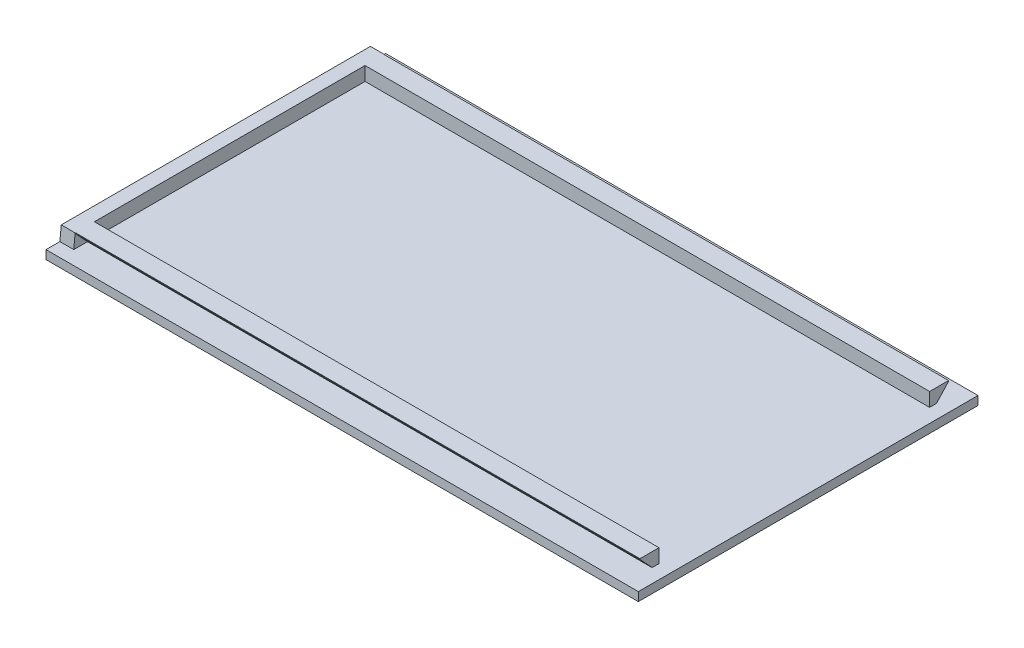
ISO-10303-21;
HEADER;
FILE_DESCRIPTION(('STEP AP214'),'2;1');
FILE_NAME('part.step','',(''),(''),'','','');
FILE_SCHEMA(('AUTOMOTIVE_DESIGN { 1 0 10303 214 1 1 1 1 }'));
ENDSEC;
DATA;
#1=APPLICATION_CONTEXT('core data for automotive mechanical design processes');
#2=APPLICATION_PROTOCOL_DEFINITION('international standard','automotive_design',2000,#1);
#3=PRODUCT_CONTEXT('',#1,'mechanical');
#4=PRODUCT('Part','Part','',(#3));
#5=PRODUCT_RELATED_PRODUCT_CATEGORY('part','',(#4));
#6=PRODUCT_DEFINITION_FORMATION('','',#4);
#7=PRODUCT_DEFINITION_CONTEXT('part definition',#1,'design');
#8=PRODUCT_DEFINITION('design','',#6,#7);
#9=PRODUCT_DEFINITION_SHAPE('','',#8);
#10=(LENGTH_UNIT() NAMED_UNIT(*) SI_UNIT(.MILLI.,.METRE.));
#11=(NAMED_UNIT(*) PLANE_ANGLE_UNIT() SI_UNIT($,.RADIAN.));
#12=(NAMED_UNIT(*) SI_UNIT($,.STERADIAN.) SOLID_ANGLE_UNIT());
#13=UNCERTAINTY_MEASURE_WITH_UNIT(LENGTH_MEASURE(1.E-05),#10,'distance_accuracy_value','');
#14=(GEOMETRIC_REPRESENTATION_CONTEXT(3) GLOBAL_UNCERTAINTY_ASSIGNED_CONTEXT((#13)) GLOBAL_UNIT_ASSIGNED_CONTEXT((#10,
#11,#12)) REPRESENTATION_CONTEXT('',''));
#15=CARTESIAN_POINT('',(0.,0.,0.));
#16=DIRECTION('',(0.,0.,1.));
#17=DIRECTION('',(1.,0.,0.));
#18=AXIS2_PLACEMENT_3D('',#15,#16,#17);
#19=CARTESIAN_POINT('',(2.01,0.,0.));
#20=DIRECTION('',(-1.,0.,0.));
#21=DIRECTION('',(0.,0.,1.));
#22=AXIS2_PLACEMENT_3D('',#19,#20,#21);
#23=PLANE('',#22);
#24=DIRECTION('',(0.,0.,-1.));
#25=VECTOR('',#24,1.);
#26=CARTESIAN_POINT('',(2.01,3.26,-46.989750156055));
#27=LINE('',#26,#25);
#28=CARTESIAN_POINT('',(2.01,3.26,-5.00000000000004));
#29=VERTEX_POINT('',#28);
#30=CARTESIAN_POINT('',(2.01,3.26,-44.2));
#31=VERTEX_POINT('',#30);
#32=EDGE_CURVE('E348',#29,#31,#27,.T.);
#33=ORIENTED_EDGE('',*,*,#32,.F.);
#34=DIRECTION('',(0.,-1.,0.));
#35=VECTOR('',#34,1.);
#36=CARTESIAN_POINT('',(2.01,0.,-5.00000000000003));
#37=LINE('',#36,#35);
#38=CARTESIAN_POINT('',(2.01,1.26,-5.00000000000004));
#39=VERTEX_POINT('',#38);
#40=EDGE_CURVE('E304',#29,#39,#37,.T.);
#41=ORIENTED_EDGE('',*,*,#40,.T.);
#42=DIRECTION('',(0.,0.,1.));
#43=VECTOR('',#42,1.);
#44=CARTESIAN_POINT('',(2.01,1.26,-47.19));
#45=LINE('',#44,#43);
#46=CARTESIAN_POINT('',(2.01,1.26,-44.2));
#47=VERTEX_POINT('',#46);
#48=EDGE_CURVE('E339',#47,#39,#45,.T.);
#49=ORIENTED_EDGE('',*,*,#48,.F.);
#50=DIRECTION('',(0.,1.,0.));
#51=VECTOR('',#50,1.);
#52=CARTESIAN_POINT('',(2.01,0.,-44.2));
#53=LINE('',#52,#51);
#54=EDGE_CURVE('E11',#47,#31,#53,.T.);
#55=ORIENTED_EDGE('',*,*,#54,.T.);
#56=EDGE_LOOP('',(#33,#41,#49,#55));
#57=FACE_BOUND('',#56,.T.);
#58=ADVANCED_FACE('F32',(#57),#23,.F.);
#59=CARTESIAN_POINT('',(2.01,1.26,-4.00000000000004));
#60=VERTEX_POINT('',#59);
#61=CARTESIAN_POINT('',(2.01,1.26,-2.01));
#62=VERTEX_POINT('',#61);
#63=EDGE_CURVE('E340',#60,#62,#45,.T.);
#64=ORIENTED_EDGE('',*,*,#63,.F.);
#65=DIRECTION('',(0.,0.733696405240078,0.679477435193979));
#66=VECTOR('',#65,1.);
#67=CARTESIAN_POINT('',(2.01,2.57584948359591,-2.78138965131976));
#68=LINE('',#67,#66);
#69=CARTESIAN_POINT('',(2.01,3.1602736895718,-2.24015344284762));
#70=VERTEX_POINT('',#69);
#71=EDGE_CURVE('E306',#60,#70,#68,.T.);
#72=ORIENTED_EDGE('',*,*,#71,.T.);
#73=DIRECTION('',(0.,0.997263104282015,-0.07393443607548));
#74=VECTOR('',#73,1.);
#75=CARTESIAN_POINT('',(2.01,-0.147896177868239,-1.99489452116399));
#76=LINE('',#75,#74);
#77=CARTESIAN_POINT('',(2.01,3.26,-2.24754688645518));
#78=VERTEX_POINT('',#77);
#79=EDGE_CURVE('E294',#70,#78,#76,.T.);
#80=ORIENTED_EDGE('',*,*,#79,.T.);
#81=CARTESIAN_POINT('',(2.01,3.26,-2.210249843945));
#82=VERTEX_POINT('',#81);
#83=EDGE_CURVE('E344',#82,#78,#27,.T.);
#84=ORIENTED_EDGE('',*,*,#83,.F.);
#85=DIRECTION('',(0.,0.995024875621891,-0.0996267880323402));
#86=VECTOR('',#85,1.);
#87=CARTESIAN_POINT('',(2.01,1.26,-2.01));
#88=LINE('',#87,#86);
#89=EDGE_CURVE('E338',#62,#82,#88,.T.);
#90=ORIENTED_EDGE('',*,*,#89,.F.);
#91=EDGE_LOOP('',(#64,#72,#80,#84,#90));
#92=FACE_BOUND('',#91,.T.);
#93=ADVANCED_FACE('F459',(#92),#23,.F.);
#94=CARTESIAN_POINT('',(0.,1.26,0.));
#95=DIRECTION('',(0.,-1.,0.));
#96=DIRECTION('',(0.,0.,-1.));
#97=AXIS2_PLACEMENT_3D('',#94,#95,#96);
#98=PLANE('',#97);
#99=ORIENTED_EDGE('',*,*,#48,.T.);
#100=DIRECTION('',(1.,0.,0.));
#101=VECTOR('',#100,1.);
#102=CARTESIAN_POINT('',(0.,1.26,-5.00000000000002));
#103=LINE('',#102,#101);
#104=CARTESIAN_POINT('',(83.79,1.26,-5.00000000000005));
#105=VERTEX_POINT('',#104);
#106=EDGE_CURVE('E295',#39,#105,#103,.T.);
#107=ORIENTED_EDGE('',*,*,#106,.T.);
#108=DIRECTION('',(0.,0.,-1.));
#109=VECTOR('',#108,1.);
#110=CARTESIAN_POINT('',(83.79,1.26,-5.00000000000005));
#111=LINE('',#110,#109);
#112=CARTESIAN_POINT('',(83.79,1.26,-4.00000000000005));
#113=VERTEX_POINT('',#112);
#114=EDGE_CURVE('E285',#113,#105,#111,.T.);
#115=ORIENTED_EDGE('',*,*,#114,.F.);
#116=DIRECTION('',(1.,0.,0.));
#117=VECTOR('',#116,1.);
#118=CARTESIAN_POINT('',(0.,1.26,-4.00000000000002));
#119=LINE('',#118,#117);
#120=EDGE_CURVE('E297',#60,#113,#119,.T.);
#121=ORIENTED_EDGE('',*,*,#120,.F.);
#122=ORIENTED_EDGE('',*,*,#63,.T.);
#123=DIRECTION('',(-1.,0.,0.));
#124=VECTOR('',#123,1.);
#125=CARTESIAN_POINT('',(2.01,1.26,-2.01));
#126=LINE('',#125,#124);
#127=CARTESIAN_POINT('',(0.,1.26,-2.01));
#128=VERTEX_POINT('',#127);
#129=EDGE_CURVE('E351',#62,#128,#126,.T.);
#130=ORIENTED_EDGE('',*,*,#129,.T.);
#131=DIRECTION('',(0.,0.,1.));
#132=VECTOR('',#131,1.);
#133=CARTESIAN_POINT('',(0.,1.26,0.));
#134=LINE('',#133,#132);
#135=CARTESIAN_POINT('',(0.,1.26,0.));
#136=VERTEX_POINT('',#135);
#137=EDGE_CURVE('E373',#128,#136,#134,.T.);
#138=ORIENTED_EDGE('',*,*,#137,.T.);
#139=DIRECTION('',(1.,0.,0.));
#140=VECTOR('',#139,1.);
#141=CARTESIAN_POINT('',(0.,1.26,0.));
#142=LINE('',#141,#140);
#143=CARTESIAN_POINT('',(85.8,1.26,0.));
#144=VERTEX_POINT('',#143);
#145=EDGE_CURVE('E372',#136,#144,#142,.T.);
#146=ORIENTED_EDGE('',*,*,#145,.T.);
#147=DIRECTION('',(0.,0.,-1.));
#148=VECTOR('',#147,1.);
#149=CARTESIAN_POINT('',(85.8,1.26,0.));
#150=LINE('',#149,#148);
#151=CARTESIAN_POINT('',(85.8,1.26,-49.2));
#152=VERTEX_POINT('',#151);
#153=EDGE_CURVE('E375',#144,#152,#150,.T.);
#154=ORIENTED_EDGE('',*,*,#153,.T.);
#155=DIRECTION('',(-1.,0.,0.));
#156=VECTOR('',#155,1.);
#157=CARTESIAN_POINT('',(0.,1.26,-49.2));
#158=LINE('',#157,#156);
#159=CARTESIAN_POINT('',(0.,1.26,-49.2));
#160=VERTEX_POINT('',#159);
#161=EDGE_CURVE('E377',#152,#160,#158,.T.);
#162=ORIENTED_EDGE('',*,*,#161,.T.);
#163=CARTESIAN_POINT('',(0.,1.26,-47.19));
#164=VERTEX_POINT('',#163);
#165=EDGE_CURVE('E369',#160,#164,#134,.T.);
#166=ORIENTED_EDGE('',*,*,#165,.T.);
#167=DIRECTION('',(-1.,0.,0.));
#168=VECTOR('',#167,1.);
#169=CARTESIAN_POINT('',(2.01,1.26,-47.19));
#170=LINE('',#169,#168);
#171=CARTESIAN_POINT('',(2.01,1.26,-47.19));
#172=VERTEX_POINT('',#171);
#173=EDGE_CURVE('E359',#172,#164,#170,.T.);
#174=ORIENTED_EDGE('',*,*,#173,.F.);
#175=CARTESIAN_POINT('',(2.01,1.26,-45.2));
#176=VERTEX_POINT('',#175);
#177=EDGE_CURVE('E335',#172,#176,#45,.T.);
#178=ORIENTED_EDGE('',*,*,#177,.T.);
#179=DIRECTION('',(1.,0.,0.));
#180=VECTOR('',#179,1.);
#181=CARTESIAN_POINT('',(0.,1.26,-45.2));
#182=LINE('',#181,#180);
#183=CARTESIAN_POINT('',(83.79,1.26,-45.2));
#184=VERTEX_POINT('',#183);
#185=EDGE_CURVE('E331',#176,#184,#182,.T.);
#186=ORIENTED_EDGE('',*,*,#185,.T.);
#187=DIRECTION('',(0.,0.,-1.));
#188=VECTOR('',#187,1.);
#189=CARTESIAN_POINT('',(83.79,1.26,-44.2));
#190=LINE('',#189,#188);
#191=CARTESIAN_POINT('',(83.79,1.26,-44.2));
#192=VERTEX_POINT('',#191);
#193=EDGE_CURVE('E311',#192,#184,#190,.T.);
#194=ORIENTED_EDGE('',*,*,#193,.F.);
#195=DIRECTION('',(1.,0.,0.));
#196=VECTOR('',#195,1.);
#197=CARTESIAN_POINT('',(0.,1.26,-44.2));
#198=LINE('',#197,#196);
#199=EDGE_CURVE('E323',#47,#192,#198,.T.);
#200=ORIENTED_EDGE('',*,*,#199,.F.);
#201=EDGE_LOOP('',(#99,#107,#115,#121,#122,#130,#138,#146,#154,#162,#166,#174,#178,#186,#194,#200));
#202=FACE_BOUND('',#201,.T.);
#203=ADVANCED_FACE('F424',(#202),#98,.F.);
#204=CARTESIAN_POINT('',(0.,1.26,0.));
#205=DIRECTION('',(1.,0.,0.));
#206=DIRECTION('',(0.,0.,-1.));
#207=AXIS2_PLACEMENT_3D('',#204,#205,#206);
#208=PLANE('',#207);
#209=DIRECTION('',(0.,0.,-1.));
#210=VECTOR('',#209,1.);
#211=CARTESIAN_POINT('',(0.,3.26,-46.989750156055));
#212=LINE('',#211,#210);
#213=CARTESIAN_POINT('',(0.,3.26,-2.210249843945));
#214=VERTEX_POINT('',#213);
#215=CARTESIAN_POINT('',(0.,3.26,-46.989750156055));
#216=VERTEX_POINT('',#215);
#217=EDGE_CURVE('E354',#214,#216,#212,.T.);
#218=ORIENTED_EDGE('',*,*,#217,.T.);
#219=DIRECTION('',(0.,-0.995024875621891,-0.0996267880323402));
#220=VECTOR('',#219,1.);
#221=CARTESIAN_POINT('',(0.,1.26,-47.19));
#222=LINE('',#221,#220);
#223=EDGE_CURVE('E356',#216,#164,#222,.T.);
#224=ORIENTED_EDGE('',*,*,#223,.T.);
#225=ORIENTED_EDGE('',*,*,#165,.F.);
#226=DIRECTION('',(0.,-1.,0.));
#227=VECTOR('',#226,1.);
#228=CARTESIAN_POINT('',(0.,1.26,-49.2));
#229=LINE('',#228,#227);
#230=CARTESIAN_POINT('',(0.,0.,-49.2));
#231=VERTEX_POINT('',#230);
#232=EDGE_CURVE('E379',#160,#231,#229,.T.);
#233=ORIENTED_EDGE('',*,*,#232,.T.);
#234=DIRECTION('',(0.,0.,1.));
#235=VECTOR('',#234,1.);
#236=CARTESIAN_POINT('',(0.,0.,0.));
#237=LINE('',#236,#235);
#238=CARTESIAN_POINT('',(0.,0.,0.));
#239=VERTEX_POINT('',#238);
#240=EDGE_CURVE('E361',#231,#239,#237,.T.);
#241=ORIENTED_EDGE('',*,*,#240,.T.);
#242=DIRECTION('',(0.,-1.,0.));
#243=VECTOR('',#242,1.);
#244=CARTESIAN_POINT('',(0.,1.26,0.));
#245=LINE('',#244,#243);
#246=EDGE_CURVE('E396',#136,#239,#245,.T.);
#247=ORIENTED_EDGE('',*,*,#246,.F.);
#248=ORIENTED_EDGE('',*,*,#137,.F.);
#249=DIRECTION('',(0.,0.995024875621891,-0.0996267880323402));
#250=VECTOR('',#249,1.);
#251=CARTESIAN_POINT('',(0.,1.26,-2.01));
#252=LINE('',#251,#250);
#253=EDGE_CURVE('E326',#128,#214,#252,.T.);
#254=ORIENTED_EDGE('',*,*,#253,.T.);
#255=EDGE_LOOP('',(#218,#224,#225,#233,#241,#247,#248,#254));
#256=FACE_BOUND('',#255,.T.);
#257=ADVANCED_FACE('F34',(#256),#208,.F.);
#258=CARTESIAN_POINT('',(0.,1.26,0.));
#259=DIRECTION('',(0.,0.,-1.));
#260=DIRECTION('',(-1.,0.,0.));
#261=AXIS2_PLACEMENT_3D('',#258,#259,#260);
#262=PLANE('',#261);
#263=DIRECTION('',(1.,0.,0.));
#264=VECTOR('',#263,1.);
#265=CARTESIAN_POINT('',(0.,0.,0.));
#266=LINE('',#265,#264);
#267=CARTESIAN_POINT('',(85.8,0.,0.));
#268=VERTEX_POINT('',#267);
#269=EDGE_CURVE('E382',#239,#268,#266,.T.);
#270=ORIENTED_EDGE('',*,*,#269,.T.);
#271=DIRECTION('',(0.,-1.,0.));
#272=VECTOR('',#271,1.);
#273=CARTESIAN_POINT('',(85.8,1.26,0.));
#274=LINE('',#273,#272);
#275=EDGE_CURVE('E393',#144,#268,#274,.T.);
#276=ORIENTED_EDGE('',*,*,#275,.F.);
#277=ORIENTED_EDGE('',*,*,#145,.F.);
#278=ORIENTED_EDGE('',*,*,#246,.T.);
#279=EDGE_LOOP('',(#270,#276,#277,#278));
#280=FACE_BOUND('',#279,.T.);
#281=ADVANCED_FACE('F497',(#280),#262,.F.);
#282=CARTESIAN_POINT('',(85.8,1.26,0.));
#283=DIRECTION('',(-1.,0.,0.));
#284=DIRECTION('',(0.,0.,1.));
#285=AXIS2_PLACEMENT_3D('',#282,#283,#284);
#286=PLANE('',#285);
#287=DIRECTION('',(0.,0.,-1.));
#288=VECTOR('',#287,1.);
#289=CARTESIAN_POINT('',(85.8,0.,0.));
#290=LINE('',#289,#288);
#291=CARTESIAN_POINT('',(85.8,0.,-49.2));
#292=VERTEX_POINT('',#291);
#293=EDGE_CURVE('E384',#268,#292,#290,.T.);
#294=ORIENTED_EDGE('',*,*,#293,.T.);
#295=DIRECTION('',(0.,-1.,0.));
#296=VECTOR('',#295,1.);
#297=CARTESIAN_POINT('',(85.8,1.26,-49.2));
#298=LINE('',#297,#296);
#299=EDGE_CURVE('E390',#152,#292,#298,.T.);
#300=ORIENTED_EDGE('',*,*,#299,.F.);
#301=ORIENTED_EDGE('',*,*,#153,.F.);
#302=ORIENTED_EDGE('',*,*,#275,.T.);
#303=EDGE_LOOP('',(#294,#300,#301,#302));
#304=FACE_BOUND('',#303,.T.);
#305=ADVANCED_FACE('F494',(#304),#286,.F.);
#306=CARTESIAN_POINT('',(0.,1.26,-49.2));
#307=DIRECTION('',(0.,0.,1.));
#308=DIRECTION('',(1.,0.,0.));
#309=AXIS2_PLACEMENT_3D('',#306,#307,#308);
#310=PLANE('',#309);
#311=DIRECTION('',(-1.,0.,0.));
#312=VECTOR('',#311,1.);
#313=CARTESIAN_POINT('',(0.,0.,-49.2));
#314=LINE('',#313,#312);
#315=EDGE_CURVE('E386',#292,#231,#314,.T.);
#316=ORIENTED_EDGE('',*,*,#315,.T.);
#317=ORIENTED_EDGE('',*,*,#232,.F.);
#318=ORIENTED_EDGE('',*,*,#161,.F.);
#319=ORIENTED_EDGE('',*,*,#299,.T.);
#320=EDGE_LOOP('',(#316,#317,#318,#319));
#321=FACE_BOUND('',#320,.T.);
#322=ADVANCED_FACE('F489',(#321),#310,.F.);
#323=CARTESIAN_POINT('',(0.,0.,0.));
#324=DIRECTION('',(0.,-1.,0.));
#325=DIRECTION('',(0.,0.,-1.));
#326=AXIS2_PLACEMENT_3D('',#323,#324,#325);
#327=PLANE('',#326);
#328=CARTESIAN_POINT('',(24.3670151213489,0.,-19.5845037734196));
#329=DIRECTION('',(0.,-1.,0.));
#330=DIRECTION('',(0.,0.,-1.));
#331=AXIS2_PLACEMENT_3D('',#328,#329,#330);
#332=CIRCLE('',#331,5.5);
#333=CARTESIAN_POINT('',(24.5437563050478,0.,-14.0873442747344));
#334=VERTEX_POINT('',#333);
#335=CARTESIAN_POINT('',(22.0546361829294,0.,-24.5747846918804));
#336=VERTEX_POINT('',#335);
#337=EDGE_CURVE('E47',#334,#336,#332,.T.);
#338=ORIENTED_EDGE('',*,*,#337,.F.);
#339=CARTESIAN_POINT('',(24.363202321441,0.,-33.043688370087));
#340=DIRECTION('',(0.,-1.,0.));
#341=DIRECTION('',(0.,0.,1.));
#342=AXIS2_PLACEMENT_3D('',#339,#340,#341);
#343=CIRCLE('',#342,18.9572039394633);
#344=CARTESIAN_POINT('',(41.3245511084577,0.,-24.5767982368934));
#345=VERTEX_POINT('',#344);
#346=EDGE_CURVE('E250',#345,#334,#343,.T.);
#347=ORIENTED_EDGE('',*,*,#346,.F.);
#348=CARTESIAN_POINT('',(24.363202321441,0.,-16.1099081036998));
#349=DIRECTION('',(0.,-1.,0.));
#350=DIRECTION('',(0.,0.,-1.));
#351=AXIS2_PLACEMENT_3D('',#348,#349,#350);
#352=CIRCLE('',#351,18.9572039394633);
#353=CARTESIAN_POINT('',(24.5437563050478,0.,-35.0662521990524));
#354=VERTEX_POINT('',#353);
#355=EDGE_CURVE('E264',#354,#345,#352,.T.);
#356=ORIENTED_EDGE('',*,*,#355,.F.);
#357=CARTESIAN_POINT('',(24.3576329942708,0.,-29.5694023636298));
#358=DIRECTION('',(0.,-1.,0.));
#359=DIRECTION('',(0.,0.,-1.));
#360=AXIS2_PLACEMENT_3D('',#357,#358,#359);
#361=CIRCLE('',#360,5.5);
#362=EDGE_CURVE('E261',#336,#354,#361,.T.);
#363=ORIENTED_EDGE('',*,*,#362,.F.);
#364=EDGE_LOOP('',(#338,#347,#356,#363));
#365=FACE_BOUND('',#364,.T.);
#366=ORIENTED_EDGE('',*,*,#240,.F.);
#367=ORIENTED_EDGE('',*,*,#315,.F.);
#368=ORIENTED_EDGE('',*,*,#293,.F.);
#369=ORIENTED_EDGE('',*,*,#269,.F.);
#370=EDGE_LOOP('',(#366,#367,#368,#369));
#371=FACE_BOUND('',#370,.T.);
#372=ADVANCED_FACE('F486',(#365,#371),#327,.T.);
#373=CARTESIAN_POINT('',(2.01,1.26,-47.19));
#374=DIRECTION('',(0.,0.0996267880323402,-0.995024875621891));
#375=DIRECTION('',(0.,0.995024875621891,0.0996267880323402));
#376=AXIS2_PLACEMENT_3D('',#373,#374,#375);
#377=PLANE('',#376);
#378=ORIENTED_EDGE('',*,*,#223,.F.);
#379=DIRECTION('',(-1.,0.,0.));
#380=VECTOR('',#379,1.);
#381=CARTESIAN_POINT('',(2.01,3.26,-46.989750156055));
#382=LINE('',#381,#380);
#383=CARTESIAN_POINT('',(2.01,3.26,-46.989750156055));
#384=VERTEX_POINT('',#383);
#385=EDGE_CURVE('E362',#384,#216,#382,.T.);
#386=ORIENTED_EDGE('',*,*,#385,.F.);
#387=DIRECTION('',(0.,-0.995024875621891,-0.0996267880323402));
#388=VECTOR('',#387,1.);
#389=CARTESIAN_POINT('',(2.01,1.26,-47.19));
#390=LINE('',#389,#388);
#391=EDGE_CURVE('E347',#384,#172,#390,.T.);
#392=ORIENTED_EDGE('',*,*,#391,.T.);
#393=ORIENTED_EDGE('',*,*,#173,.T.);
#394=EDGE_LOOP('',(#378,#386,#392,#393));
#395=FACE_BOUND('',#394,.T.);
#396=ADVANCED_FACE('F429',(#395),#377,.T.);
#397=CARTESIAN_POINT('',(2.01,3.26,-46.989750156055));
#398=DIRECTION('',(0.,1.,0.));
#399=DIRECTION('',(0.,0.,1.));
#400=AXIS2_PLACEMENT_3D('',#397,#398,#399);
#401=PLANE('',#400);
#402=ORIENTED_EDGE('',*,*,#83,.T.);
#403=DIRECTION('',(1.,0.,0.));
#404=VECTOR('',#403,1.);
#405=CARTESIAN_POINT('',(0.,3.26,-2.24754688645517));
#406=LINE('',#405,#404);
#407=CARTESIAN_POINT('',(83.79,3.26,-2.24754688645519));
#408=VERTEX_POINT('',#407);
#409=EDGE_CURVE('E291',#78,#408,#406,.T.);
#410=ORIENTED_EDGE('',*,*,#409,.T.);
#411=DIRECTION('',(0.,0.,1.));
#412=VECTOR('',#411,1.);
#413=CARTESIAN_POINT('',(83.79,3.26,-2.24754688645519));
#414=LINE('',#413,#412);
#415=CARTESIAN_POINT('',(83.79,3.26,-5.00000000000005));
#416=VERTEX_POINT('',#415);
#417=EDGE_CURVE('E271',#416,#408,#414,.T.);
#418=ORIENTED_EDGE('',*,*,#417,.F.);
#419=DIRECTION('',(1.,0.,0.));
#420=VECTOR('',#419,1.);
#421=CARTESIAN_POINT('',(0.,3.26,-5.00000000000002));
#422=LINE('',#421,#420);
#423=EDGE_CURVE('E292',#29,#416,#422,.T.);
#424=ORIENTED_EDGE('',*,*,#423,.F.);
#425=ORIENTED_EDGE('',*,*,#32,.T.);
#426=DIRECTION('',(1.,0.,0.));
#427=VECTOR('',#426,1.);
#428=CARTESIAN_POINT('',(0.,3.26,-44.2));
#429=LINE('',#428,#427);
#430=CARTESIAN_POINT('',(83.79,3.26,-44.2));
#431=VERTEX_POINT('',#430);
#432=EDGE_CURVE('E324',#31,#431,#429,.T.);
#433=ORIENTED_EDGE('',*,*,#432,.T.);
#434=DIRECTION('',(0.,0.,1.));
#435=VECTOR('',#434,1.);
#436=CARTESIAN_POINT('',(83.79,3.26,-46.9524531135449));
#437=LINE('',#436,#435);
#438=CARTESIAN_POINT('',(83.79,3.26,-46.9524531135449));
#439=VERTEX_POINT('',#438);
#440=EDGE_CURVE('E320',#439,#431,#437,.T.);
#441=ORIENTED_EDGE('',*,*,#440,.F.);
#442=DIRECTION('',(1.,0.,0.));
#443=VECTOR('',#442,1.);
#444=CARTESIAN_POINT('',(0.,3.26,-46.9524531135448));
#445=LINE('',#444,#443);
#446=CARTESIAN_POINT('',(2.01,3.26,-46.9524531135448));
#447=VERTEX_POINT('',#446);
#448=EDGE_CURVE('E327',#447,#439,#445,.T.);
#449=ORIENTED_EDGE('',*,*,#448,.F.);
#450=EDGE_CURVE('E343',#447,#384,#27,.T.);
#451=ORIENTED_EDGE('',*,*,#450,.T.);
#452=ORIENTED_EDGE('',*,*,#385,.T.);
#453=ORIENTED_EDGE('',*,*,#217,.F.);
#454=DIRECTION('',(-1.,0.,0.));
#455=VECTOR('',#454,1.);
#456=CARTESIAN_POINT('',(2.01,3.26,-2.210249843945));
#457=LINE('',#456,#455);
#458=EDGE_CURVE('E365',#82,#214,#457,.T.);
#459=ORIENTED_EDGE('',*,*,#458,.F.);
#460=EDGE_LOOP('',(#402,#410,#418,#424,#425,#433,#441,#449,#451,#452,#453,#459));
#461=FACE_BOUND('',#460,.T.);
#462=ADVANCED_FACE('F413',(#461),#401,.T.);
#463=CARTESIAN_POINT('',(2.01,1.26,-2.01));
#464=DIRECTION('',(0.,0.0996267880323402,0.995024875621891));
#465=DIRECTION('',(0.,-0.995024875621891,0.0996267880323402));
#466=AXIS2_PLACEMENT_3D('',#463,#464,#465);
#467=PLANE('',#466);
#468=ORIENTED_EDGE('',*,*,#253,.F.);
#469=ORIENTED_EDGE('',*,*,#129,.F.);
#470=ORIENTED_EDGE('',*,*,#89,.T.);
#471=ORIENTED_EDGE('',*,*,#458,.T.);
#472=EDGE_LOOP('',(#468,#469,#470,#471));
#473=FACE_BOUND('',#472,.T.);
#474=ADVANCED_FACE('F437',(#473),#467,.T.);
#475=ORIENTED_EDGE('',*,*,#450,.F.);
#476=DIRECTION('',(0.,-0.997263104282015,-0.07393443607548));
#477=VECTOR('',#476,1.);
#478=CARTESIAN_POINT('',(2.01,3.47972241564325,-46.9361634776163));
#479=LINE('',#478,#477);
#480=CARTESIAN_POINT('',(2.01,3.1602736895718,-46.9598465571524));
#481=VERTEX_POINT('',#480);
#482=EDGE_CURVE('E40',#447,#481,#479,.T.);
#483=ORIENTED_EDGE('',*,*,#482,.T.);
#484=DIRECTION('',(0.,-0.733696405240078,0.679477435193979));
#485=VECTOR('',#484,1.);
#486=CARTESIAN_POINT('',(2.01,-21.9518339772677,-23.7034827697411));
#487=LINE('',#486,#485);
#488=EDGE_CURVE('E399',#481,#176,#487,.T.);
#489=ORIENTED_EDGE('',*,*,#488,.T.);
#490=ORIENTED_EDGE('',*,*,#177,.F.);
#491=ORIENTED_EDGE('',*,*,#391,.F.);
#492=EDGE_LOOP('',(#475,#483,#489,#490,#491));
#493=FACE_BOUND('',#492,.T.);
#494=ADVANCED_FACE('F404',(#493),#23,.F.);
#495=CARTESIAN_POINT('',(0.,3.26,-44.2));
#496=DIRECTION('',(0.,0.,1.));
#497=DIRECTION('',(1.,0.,0.));
#498=AXIS2_PLACEMENT_3D('',#495,#496,#497);
#499=PLANE('',#498);
#500=ORIENTED_EDGE('',*,*,#54,.F.);
#501=ORIENTED_EDGE('',*,*,#199,.T.);
#502=DIRECTION('',(0.,-1.,0.));
#503=VECTOR('',#502,1.);
#504=CARTESIAN_POINT('',(83.79,3.26,-44.2));
#505=LINE('',#504,#503);
#506=EDGE_CURVE('E308',#431,#192,#505,.T.);
#507=ORIENTED_EDGE('',*,*,#506,.F.);
#508=ORIENTED_EDGE('',*,*,#432,.F.);
#509=EDGE_LOOP('',(#500,#501,#507,#508));
#510=FACE_BOUND('',#509,.T.);
#511=ADVANCED_FACE('F465',(#510),#499,.T.);
#512=CARTESIAN_POINT('',(0.,3.1602736895718,-46.9598465571524));
#513=DIRECTION('',(0.,0.07393443607548,-0.997263104282015));
#514=DIRECTION('',(0.,0.997263104282015,0.07393443607548));
#515=AXIS2_PLACEMENT_3D('',#512,#513,#514);
#516=PLANE('',#515);
#517=ORIENTED_EDGE('',*,*,#482,.F.);
#518=ORIENTED_EDGE('',*,*,#448,.T.);
#519=DIRECTION('',(0.,0.997263104282015,0.07393443607548));
#520=VECTOR('',#519,1.);
#521=CARTESIAN_POINT('',(83.79,3.1602736895718,-46.9598465571524));
#522=LINE('',#521,#520);
#523=CARTESIAN_POINT('',(83.79,3.1602736895718,-46.9598465571524));
#524=VERTEX_POINT('',#523);
#525=EDGE_CURVE('E317',#524,#439,#522,.T.);
#526=ORIENTED_EDGE('',*,*,#525,.F.);
#527=DIRECTION('',(1.,0.,0.));
#528=VECTOR('',#527,1.);
#529=CARTESIAN_POINT('',(0.,3.1602736895718,-46.9598465571524));
#530=LINE('',#529,#528);
#531=EDGE_CURVE('E329',#481,#524,#530,.T.);
#532=ORIENTED_EDGE('',*,*,#531,.F.);
#533=EDGE_LOOP('',(#517,#518,#526,#532));
#534=FACE_BOUND('',#533,.T.);
#535=ADVANCED_FACE('F409',(#534),#516,.T.);
#536=CARTESIAN_POINT('',(0.,1.26,-45.2));
#537=DIRECTION('',(0.,-0.679477435193979,-0.733696405240078));
#538=DIRECTION('',(0.,0.733696405240078,-0.679477435193979));
#539=AXIS2_PLACEMENT_3D('',#536,#537,#538);
#540=PLANE('',#539);
#541=ORIENTED_EDGE('',*,*,#488,.F.);
#542=ORIENTED_EDGE('',*,*,#531,.T.);
#543=DIRECTION('',(0.,0.733696405240078,-0.679477435193979));
#544=VECTOR('',#543,1.);
#545=CARTESIAN_POINT('',(83.79,1.26,-45.2));
#546=LINE('',#545,#544);
#547=EDGE_CURVE('E314',#184,#524,#546,.T.);
#548=ORIENTED_EDGE('',*,*,#547,.F.);
#549=ORIENTED_EDGE('',*,*,#185,.F.);
#550=EDGE_LOOP('',(#541,#542,#548,#549));
#551=FACE_BOUND('',#550,.T.);
#552=ADVANCED_FACE('F421',(#551),#540,.T.);
#553=CARTESIAN_POINT('',(83.79,0.,0.));
#554=DIRECTION('',(1.,0.,0.));
#555=DIRECTION('',(0.,0.,-1.));
#556=AXIS2_PLACEMENT_3D('',#553,#554,#555);
#557=PLANE('',#556);
#558=ORIENTED_EDGE('',*,*,#506,.T.);
#559=ORIENTED_EDGE('',*,*,#193,.T.);
#560=ORIENTED_EDGE('',*,*,#547,.T.);
#561=ORIENTED_EDGE('',*,*,#525,.T.);
#562=ORIENTED_EDGE('',*,*,#440,.T.);
#563=EDGE_LOOP('',(#558,#559,#560,#561,#562));
#564=FACE_BOUND('',#563,.T.);
#565=ADVANCED_FACE('F418',(#564),#557,.T.);
#566=CARTESIAN_POINT('',(0.,1.26,-4.00000000000002));
#567=DIRECTION('',(0.,-0.679477435193979,0.733696405240078));
#568=DIRECTION('',(0.,-0.733696405240078,-0.679477435193979));
#569=AXIS2_PLACEMENT_3D('',#566,#567,#568);
#570=PLANE('',#569);
#571=ORIENTED_EDGE('',*,*,#71,.F.);
#572=ORIENTED_EDGE('',*,*,#120,.T.);
#573=DIRECTION('',(0.,-0.733696405240078,-0.679477435193979));
#574=VECTOR('',#573,1.);
#575=CARTESIAN_POINT('',(83.79,1.26,-4.00000000000005));
#576=LINE('',#575,#574);
#577=CARTESIAN_POINT('',(83.79,3.1602736895718,-2.24015344284765));
#578=VERTEX_POINT('',#577);
#579=EDGE_CURVE('E282',#578,#113,#576,.T.);
#580=ORIENTED_EDGE('',*,*,#579,.F.);
#581=DIRECTION('',(1.,0.,0.));
#582=VECTOR('',#581,1.);
#583=CARTESIAN_POINT('',(0.,3.1602736895718,-2.24015344284762));
#584=LINE('',#583,#582);
#585=EDGE_CURVE('E300',#70,#578,#584,.T.);
#586=ORIENTED_EDGE('',*,*,#585,.F.);
#587=EDGE_LOOP('',(#571,#572,#580,#586));
#588=FACE_BOUND('',#587,.T.);
#589=ADVANCED_FACE('F456',(#588),#570,.T.);
#590=CARTESIAN_POINT('',(0.,3.26,-5.00000000000002));
#591=DIRECTION('',(0.,0.,-1.));
#592=DIRECTION('',(-1.,0.,0.));
#593=AXIS2_PLACEMENT_3D('',#590,#591,#592);
#594=PLANE('',#593);
#595=ORIENTED_EDGE('',*,*,#40,.F.);
#596=ORIENTED_EDGE('',*,*,#423,.T.);
#597=DIRECTION('',(0.,1.,0.));
#598=VECTOR('',#597,1.);
#599=CARTESIAN_POINT('',(83.79,3.26,-5.00000000000005));
#600=LINE('',#599,#598);
#601=EDGE_CURVE('E288',#105,#416,#600,.T.);
#602=ORIENTED_EDGE('',*,*,#601,.F.);
#603=ORIENTED_EDGE('',*,*,#106,.F.);
#604=EDGE_LOOP('',(#595,#596,#602,#603));
#605=FACE_BOUND('',#604,.T.);
#606=ADVANCED_FACE('F449',(#605),#594,.T.);
#607=CARTESIAN_POINT('',(0.,3.1602736895718,-2.24015344284762));
#608=DIRECTION('',(0.,0.07393443607548,0.997263104282015));
#609=DIRECTION('',(0.,-0.997263104282015,0.07393443607548));
#610=AXIS2_PLACEMENT_3D('',#607,#608,#609);
#611=PLANE('',#610);
#612=ORIENTED_EDGE('',*,*,#79,.F.);
#613=ORIENTED_EDGE('',*,*,#585,.T.);
#614=DIRECTION('',(0.,-0.997263104282015,0.07393443607548));
#615=VECTOR('',#614,1.);
#616=CARTESIAN_POINT('',(83.79,3.1602736895718,-2.24015344284765));
#617=LINE('',#616,#615);
#618=EDGE_CURVE('E279',#408,#578,#617,.T.);
#619=ORIENTED_EDGE('',*,*,#618,.F.);
#620=ORIENTED_EDGE('',*,*,#409,.F.);
#621=EDGE_LOOP('',(#612,#613,#619,#620));
#622=FACE_BOUND('',#621,.T.);
#623=ADVANCED_FACE('F462',(#622),#611,.T.);
#624=CARTESIAN_POINT('',(83.79,0.,0.));
#625=DIRECTION('',(-1.,0.,0.));
#626=DIRECTION('',(0.,0.,1.));
#627=AXIS2_PLACEMENT_3D('',#624,#625,#626);
#628=PLANE('',#627);
#629=ORIENTED_EDGE('',*,*,#417,.T.);
#630=ORIENTED_EDGE('',*,*,#618,.T.);
#631=ORIENTED_EDGE('',*,*,#579,.T.);
#632=ORIENTED_EDGE('',*,*,#114,.T.);
#633=ORIENTED_EDGE('',*,*,#601,.T.);
#634=EDGE_LOOP('',(#629,#630,#631,#632,#633));
#635=FACE_BOUND('',#634,.T.);
#636=ADVANCED_FACE('F453',(#635),#628,.F.);
#637=CARTESIAN_POINT('',(24.3670151213489,0.6,-19.5845037734196));
#638=DIRECTION('',(0.,-1.,0.));
#639=DIRECTION('',(0.,0.,-1.));
#640=AXIS2_PLACEMENT_3D('',#637,#638,#639);
#641=CYLINDRICAL_SURFACE('',#640,5.5);
#642=ORIENTED_EDGE('',*,*,#337,.T.);
#643=DIRECTION('',(0.,-1.,0.));
#644=VECTOR('',#643,1.);
#645=CARTESIAN_POINT('',(22.0546361829294,0.6,-24.5747846918804));
#646=LINE('',#645,#644);
#647=CARTESIAN_POINT('',(22.0546361829294,0.6,-24.5747846918804));
#648=VERTEX_POINT('',#647);
#649=EDGE_CURVE('E259',#648,#336,#646,.T.);
#650=ORIENTED_EDGE('',*,*,#649,.F.);
#651=CARTESIAN_POINT('',(24.3670151213489,0.6,-19.5845037734196));
#652=DIRECTION('',(0.,-1.,0.));
#653=DIRECTION('',(0.,0.,-1.));
#654=AXIS2_PLACEMENT_3D('',#651,#652,#653);
#655=CIRCLE('',#654,5.5);
#656=CARTESIAN_POINT('',(24.5437563050478,0.6,-14.0873442747344));
#657=VERTEX_POINT('',#656);
#658=EDGE_CURVE('E246',#657,#648,#655,.T.);
#659=ORIENTED_EDGE('',*,*,#658,.F.);
#660=DIRECTION('',(0.,-1.,0.));
#661=VECTOR('',#660,1.);
#662=CARTESIAN_POINT('',(24.5437563050478,0.6,-14.0873442747344));
#663=LINE('',#662,#661);
#664=EDGE_CURVE('E269',#657,#334,#663,.T.);
#665=ORIENTED_EDGE('',*,*,#664,.T.);
#666=EDGE_LOOP('',(#642,#650,#659,#665));
#667=FACE_BOUND('',#666,.T.);
#668=ADVANCED_FACE('F582',(#667),#641,.F.);
#669=CARTESIAN_POINT('',(24.363202321441,0.6,-33.043688370087));
#670=DIRECTION('',(0.,-1.,0.));
#671=DIRECTION('',(0.,0.,-1.));
#672=AXIS2_PLACEMENT_3D('',#669,#670,#671);
#673=CYLINDRICAL_SURFACE('',#672,18.9572039394633);
#674=ORIENTED_EDGE('',*,*,#346,.T.);
#675=ORIENTED_EDGE('',*,*,#664,.F.);
#676=CARTESIAN_POINT('',(24.363202321441,0.6,-33.043688370087));
#677=DIRECTION('',(0.,-1.,0.));
#678=DIRECTION('',(0.,0.,1.));
#679=AXIS2_PLACEMENT_3D('',#676,#677,#678);
#680=CIRCLE('',#679,18.9572039394633);
#681=CARTESIAN_POINT('',(41.3245511084577,0.6,-24.5767982368934));
#682=VERTEX_POINT('',#681);
#683=EDGE_CURVE('E256',#682,#657,#680,.T.);
#684=ORIENTED_EDGE('',*,*,#683,.F.);
#685=DIRECTION('',(0.,-1.,0.));
#686=VECTOR('',#685,1.);
#687=CARTESIAN_POINT('',(41.3245511084577,0.6,-24.5767982368934));
#688=LINE('',#687,#686);
#689=EDGE_CURVE('E272',#682,#345,#688,.T.);
#690=ORIENTED_EDGE('',*,*,#689,.T.);
#691=EDGE_LOOP('',(#674,#675,#684,#690));
#692=FACE_BOUND('',#691,.T.);
#693=ADVANCED_FACE('F587',(#692),#673,.F.);
#694=CARTESIAN_POINT('',(24.363202321441,0.6,-16.1099081036998));
#695=DIRECTION('',(0.,-1.,0.));
#696=DIRECTION('',(0.,0.,-1.));
#697=AXIS2_PLACEMENT_3D('',#694,#695,#696);
#698=CYLINDRICAL_SURFACE('',#697,18.9572039394633);
#699=ORIENTED_EDGE('',*,*,#355,.T.);
#700=ORIENTED_EDGE('',*,*,#689,.F.);
#701=CARTESIAN_POINT('',(24.363202321441,0.6,-16.1099081036998));
#702=DIRECTION('',(0.,-1.,0.));
#703=DIRECTION('',(0.,0.,-1.));
#704=AXIS2_PLACEMENT_3D('',#701,#702,#703);
#705=CIRCLE('',#704,18.9572039394633);
#706=CARTESIAN_POINT('',(24.5437563050478,0.6,-35.0662521990524));
#707=VERTEX_POINT('',#706);
#708=EDGE_CURVE('E253',#707,#682,#705,.T.);
#709=ORIENTED_EDGE('',*,*,#708,.F.);
#710=DIRECTION('',(0.,-1.,0.));
#711=VECTOR('',#710,1.);
#712=CARTESIAN_POINT('',(24.5437563050478,0.6,-35.0662521990524));
#713=LINE('',#712,#711);
#714=EDGE_CURVE('E274',#707,#354,#713,.T.);
#715=ORIENTED_EDGE('',*,*,#714,.T.);
#716=EDGE_LOOP('',(#699,#700,#709,#715));
#717=FACE_BOUND('',#716,.T.);
#718=ADVANCED_FACE('F597',(#717),#698,.F.);
#719=CARTESIAN_POINT('',(24.3576329942708,0.6,-29.5694023636298));
#720=DIRECTION('',(0.,-1.,0.));
#721=DIRECTION('',(0.,0.,-1.));
#722=AXIS2_PLACEMENT_3D('',#719,#720,#721);
#723=CYLINDRICAL_SURFACE('',#722,5.5);
#724=ORIENTED_EDGE('',*,*,#362,.T.);
#725=ORIENTED_EDGE('',*,*,#714,.F.);
#726=CARTESIAN_POINT('',(24.3576329942708,0.6,-29.5694023636298));
#727=DIRECTION('',(0.,-1.,0.));
#728=DIRECTION('',(0.,0.,-1.));
#729=AXIS2_PLACEMENT_3D('',#726,#727,#728);
#730=CIRCLE('',#729,5.5);
#731=EDGE_CURVE('E249',#648,#707,#730,.T.);
#732=ORIENTED_EDGE('',*,*,#731,.F.);
#733=ORIENTED_EDGE('',*,*,#649,.T.);
#734=EDGE_LOOP('',(#724,#725,#732,#733));
#735=FACE_BOUND('',#734,.T.);
#736=ADVANCED_FACE('F607',(#735),#723,.F.);
#737=CARTESIAN_POINT('',(24.3623240578099,0.6,-24.5769530685247));
#738=DIRECTION('',(0.,-1.,0.));
#739=DIRECTION('',(0.,0.,-1.));
#740=AXIS2_PLACEMENT_3D('',#737,#738,#739);
#741=PLANE('',#740);
#742=CARTESIAN_POINT('',(24.363202321441,0.6,-16.1099081036998));
#743=DIRECTION('',(0.,-1.,0.));
#744=DIRECTION('',(0.,0.,-1.));
#745=AXIS2_PLACEMENT_3D('',#742,#743,#744);
#746=CIRCLE('',#745,18.4572039394634);
#747=CARTESIAN_POINT('',(24.5328091941894,0.6,-34.566332751276));
#748=VERTEX_POINT('',#747);
#749=CARTESIAN_POINT('',(40.7638166006493,0.6,-24.5767982368934));
#750=VERTEX_POINT('',#749);
#751=EDGE_CURVE('E217',#748,#750,#746,.T.);
#752=ORIENTED_EDGE('',*,*,#751,.F.);
#753=CARTESIAN_POINT('',(24.3576329942708,0.6,-29.5694023636298));
#754=DIRECTION('',(0.,-1.,0.));
#755=DIRECTION('',(0.,0.,-1.));
#756=AXIS2_PLACEMENT_3D('',#753,#754,#755);
#757=CIRCLE('',#756,5.);
#758=CARTESIAN_POINT('',(24.0876825403157,0.6,-24.5766950066531));
#759=VERTEX_POINT('',#758);
#760=EDGE_CURVE('E227',#759,#748,#757,.T.);
#761=ORIENTED_EDGE('',*,*,#760,.F.);
#762=CARTESIAN_POINT('',(24.3670151213489,0.6,-19.5845037734196));
#763=DIRECTION('',(0.,-1.,0.));
#764=DIRECTION('',(0.,0.,-1.));
#765=AXIS2_PLACEMENT_3D('',#762,#763,#764);
#766=CIRCLE('',#765,5.);
#767=CARTESIAN_POINT('',(24.5332432489444,0.6,-14.587267716398));
#768=VERTEX_POINT('',#767);
#769=EDGE_CURVE('E209',#768,#759,#766,.T.);
#770=ORIENTED_EDGE('',*,*,#769,.F.);
#771=CARTESIAN_POINT('',(24.363202321441,0.6,-33.043688370087));
#772=DIRECTION('',(0.,-1.,0.));
#773=DIRECTION('',(0.,0.,1.));
#774=AXIS2_PLACEMENT_3D('',#771,#772,#773);
#775=CIRCLE('',#774,18.4572039394634);
#776=EDGE_CURVE('E224',#750,#768,#775,.T.);
#777=ORIENTED_EDGE('',*,*,#776,.F.);
#778=EDGE_LOOP('',(#752,#761,#770,#777));
#779=FACE_BOUND('',#778,.T.);
#780=ORIENTED_EDGE('',*,*,#658,.T.);
#781=ORIENTED_EDGE('',*,*,#731,.T.);
#782=ORIENTED_EDGE('',*,*,#708,.T.);
#783=ORIENTED_EDGE('',*,*,#683,.T.);
#784=EDGE_LOOP('',(#780,#781,#782,#783));
#785=FACE_BOUND('',#784,.T.);
#786=ADVANCED_FACE('F222',(#779,#785),#741,.T.);
#787=CARTESIAN_POINT('',(24.363202321441,0.6,-33.043688370087));
#788=DIRECTION('',(0.,-1.,0.));
#789=DIRECTION('',(0.,0.,-1.));
#790=AXIS2_PLACEMENT_3D('',#787,#788,#789);
#791=CYLINDRICAL_SURFACE('',#790,18.4572039394634);
#792=CARTESIAN_POINT('',(24.363202321441,0.,-33.043688370087));
#793=DIRECTION('',(0.,-1.,0.));
#794=DIRECTION('',(0.,0.,1.));
#795=AXIS2_PLACEMENT_3D('',#792,#793,#794);
#796=CIRCLE('',#795,18.4572039394634);
#797=CARTESIAN_POINT('',(40.7638166006493,0.,-24.5767982368934));
#798=VERTEX_POINT('',#797);
#799=CARTESIAN_POINT('',(24.5332432489444,0.,-14.587267716398));
#800=VERTEX_POINT('',#799);
#801=EDGE_CURVE('E238',#798,#800,#796,.T.);
#802=ORIENTED_EDGE('',*,*,#801,.F.);
#803=DIRECTION('',(0.,-1.,0.));
#804=VECTOR('',#803,1.);
#805=CARTESIAN_POINT('',(40.7638166006493,0.6,-24.5767982368934));
#806=LINE('',#805,#804);
#807=EDGE_CURVE('E230',#750,#798,#806,.T.);
#808=ORIENTED_EDGE('',*,*,#807,.F.);
#809=ORIENTED_EDGE('',*,*,#776,.T.);
#810=DIRECTION('',(0.,-1.,0.));
#811=VECTOR('',#810,1.);
#812=CARTESIAN_POINT('',(24.5332432489444,0.6,-14.587267716398));
#813=LINE('',#812,#811);
#814=EDGE_CURVE('E206',#768,#800,#813,.T.);
#815=ORIENTED_EDGE('',*,*,#814,.T.);
#816=EDGE_LOOP('',(#802,#808,#809,#815));
#817=FACE_BOUND('',#816,.T.);
#818=ADVANCED_FACE('F229',(#817),#791,.T.);
#819=CARTESIAN_POINT('',(24.363202321441,0.6,-16.1099081036998));
#820=DIRECTION('',(0.,-1.,0.));
#821=DIRECTION('',(0.,0.,-1.));
#822=AXIS2_PLACEMENT_3D('',#819,#820,#821);
#823=CYLINDRICAL_SURFACE('',#822,18.4572039394634);
#824=CARTESIAN_POINT('',(24.363202321441,0.,-16.1099081036998));
#825=DIRECTION('',(0.,-1.,0.));
#826=DIRECTION('',(0.,0.,-1.));
#827=AXIS2_PLACEMENT_3D('',#824,#825,#826);
#828=CIRCLE('',#827,18.4572039394634);
#829=CARTESIAN_POINT('',(24.5328091941894,0.,-34.566332751276));
#830=VERTEX_POINT('',#829);
#831=EDGE_CURVE('E231',#830,#798,#828,.T.);
#832=ORIENTED_EDGE('',*,*,#831,.F.);
#833=DIRECTION('',(0.,-1.,0.));
#834=VECTOR('',#833,1.);
#835=CARTESIAN_POINT('',(24.5328091941894,0.6,-34.566332751276));
#836=LINE('',#835,#834);
#837=EDGE_CURVE('E243',#748,#830,#836,.T.);
#838=ORIENTED_EDGE('',*,*,#837,.F.);
#839=ORIENTED_EDGE('',*,*,#751,.T.);
#840=ORIENTED_EDGE('',*,*,#807,.T.);
#841=EDGE_LOOP('',(#832,#838,#839,#840));
#842=FACE_BOUND('',#841,.T.);
#843=ADVANCED_FACE('F634',(#842),#823,.T.);
#844=CARTESIAN_POINT('',(24.3576329942708,0.6,-29.5694023636298));
#845=DIRECTION('',(0.,-1.,0.));
#846=DIRECTION('',(0.,0.,-1.));
#847=AXIS2_PLACEMENT_3D('',#844,#845,#846);
#848=CYLINDRICAL_SURFACE('',#847,5.);
#849=CARTESIAN_POINT('',(24.3576329942708,0.,-29.5694023636298));
#850=DIRECTION('',(0.,-1.,0.));
#851=DIRECTION('',(0.,0.,-1.));
#852=AXIS2_PLACEMENT_3D('',#849,#850,#851);
#853=CIRCLE('',#852,5.);
#854=CARTESIAN_POINT('',(24.0876825403157,0.,-24.5766950066531));
#855=VERTEX_POINT('',#854);
#856=EDGE_CURVE('E55',#855,#830,#853,.T.);
#857=ORIENTED_EDGE('',*,*,#856,.F.);
#858=DIRECTION('',(0.,-1.,0.));
#859=VECTOR('',#858,1.);
#860=CARTESIAN_POINT('',(24.0876825403157,0.6,-24.5766950066531));
#861=LINE('',#860,#859);
#862=EDGE_CURVE('E216',#759,#855,#861,.T.);
#863=ORIENTED_EDGE('',*,*,#862,.F.);
#864=ORIENTED_EDGE('',*,*,#760,.T.);
#865=ORIENTED_EDGE('',*,*,#837,.T.);
#866=EDGE_LOOP('',(#857,#863,#864,#865));
#867=FACE_BOUND('',#866,.T.);
#868=ADVANCED_FACE('F643',(#867),#848,.T.);
#869=CARTESIAN_POINT('',(24.3670151213489,0.6,-19.5845037734196));
#870=DIRECTION('',(0.,-1.,0.));
#871=DIRECTION('',(0.,0.,-1.));
#872=AXIS2_PLACEMENT_3D('',#869,#870,#871);
#873=CYLINDRICAL_SURFACE('',#872,5.);
#874=CARTESIAN_POINT('',(24.3670151213489,0.,-19.5845037734196));
#875=DIRECTION('',(0.,-1.,0.));
#876=DIRECTION('',(0.,0.,-1.));
#877=AXIS2_PLACEMENT_3D('',#874,#875,#876);
#878=CIRCLE('',#877,5.);
#879=EDGE_CURVE('E211',#800,#855,#878,.T.);
#880=ORIENTED_EDGE('',*,*,#879,.F.);
#881=ORIENTED_EDGE('',*,*,#814,.F.);
#882=ORIENTED_EDGE('',*,*,#769,.T.);
#883=ORIENTED_EDGE('',*,*,#862,.T.);
#884=EDGE_LOOP('',(#880,#881,#882,#883));
#885=FACE_BOUND('',#884,.T.);
#886=ADVANCED_FACE('F208',(#885),#873,.T.);
#887=ORIENTED_EDGE('',*,*,#831,.T.);
#888=ORIENTED_EDGE('',*,*,#801,.T.);
#889=ORIENTED_EDGE('',*,*,#879,.T.);
#890=ORIENTED_EDGE('',*,*,#856,.T.);
#891=EDGE_LOOP('',(#887,#888,#889,#890));
#892=FACE_BOUND('',#891,.T.);
#893=ADVANCED_FACE('F491',(#892),#327,.T.);
#894=CLOSED_SHELL('',(#58,#93,#203,#257,#281,#305,#322,#372,#396,#462,#474,#494,#511,#535,#552,
#565,#589,#606,#623,#636,#668,#693,#718,#736,#786,#818,#843,#868,#886,#893));
#895=MANIFOLD_SOLID_BREP('B2',#894);
#896=ADVANCED_BREP_SHAPE_REPRESENTATION('',(#18,#895),#14);
#897=SHAPE_DEFINITION_REPRESENTATION(#9,#896);
ENDSEC;
END-ISO-10303-21;
